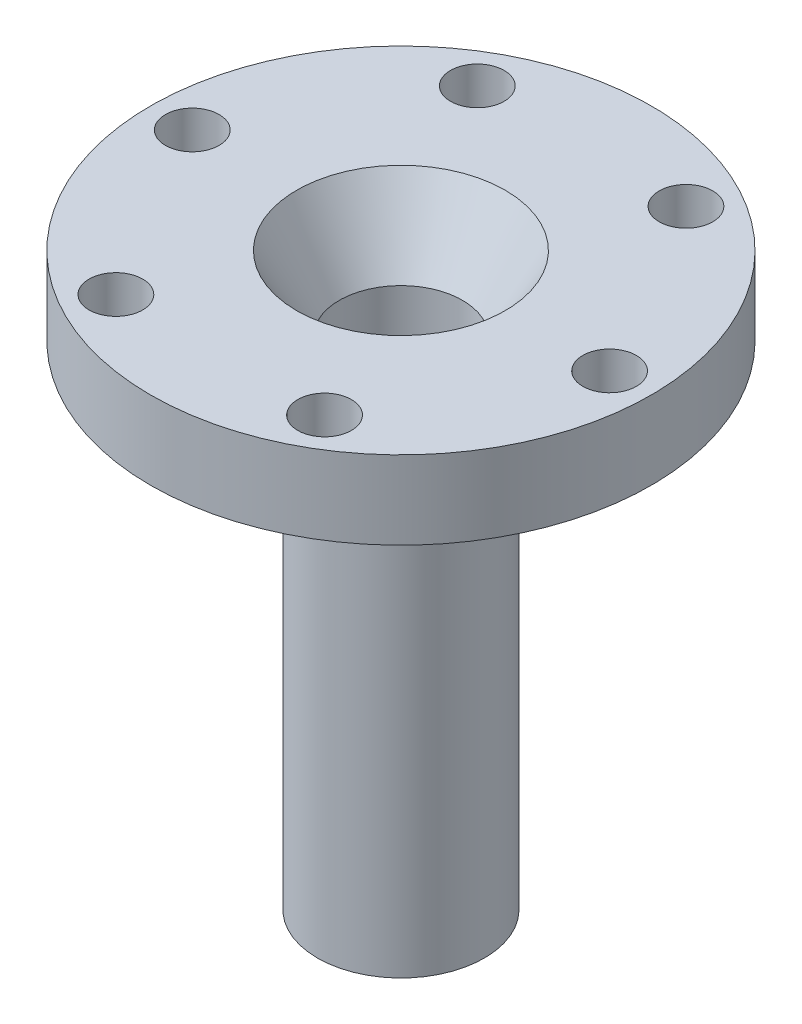
ISO-10303-21;
HEADER;
FILE_DESCRIPTION(('STEP AP214'),'2;1');
FILE_NAME('part.step','',(''),(''),'','','');
FILE_SCHEMA(('AUTOMOTIVE_DESIGN { 1 0 10303 214 1 1 1 1 }'));
ENDSEC;
DATA;
#1=APPLICATION_CONTEXT('core data for automotive mechanical design processes');
#2=APPLICATION_PROTOCOL_DEFINITION('international standard','automotive_design',2000,#1);
#3=PRODUCT_CONTEXT('',#1,'mechanical');
#4=PRODUCT('Part','Part','',(#3));
#5=PRODUCT_RELATED_PRODUCT_CATEGORY('part','',(#4));
#6=PRODUCT_DEFINITION_FORMATION('','',#4);
#7=PRODUCT_DEFINITION_CONTEXT('part definition',#1,'design');
#8=PRODUCT_DEFINITION('design','',#6,#7);
#9=PRODUCT_DEFINITION_SHAPE('','',#8);
#10=(LENGTH_UNIT() NAMED_UNIT(*) SI_UNIT(.MILLI.,.METRE.));
#11=(NAMED_UNIT(*) PLANE_ANGLE_UNIT() SI_UNIT($,.RADIAN.));
#12=(NAMED_UNIT(*) SI_UNIT($,.STERADIAN.) SOLID_ANGLE_UNIT());
#13=UNCERTAINTY_MEASURE_WITH_UNIT(LENGTH_MEASURE(1.E-05),#10,'distance_accuracy_value','');
#14=(GEOMETRIC_REPRESENTATION_CONTEXT(3) GLOBAL_UNCERTAINTY_ASSIGNED_CONTEXT((#13)) GLOBAL_UNIT_ASSIGNED_CONTEXT((#10,
#11,#12)) REPRESENTATION_CONTEXT('',''));
#15=CARTESIAN_POINT('',(0.,0.,0.));
#16=DIRECTION('',(0.,0.,1.));
#17=DIRECTION('',(1.,0.,0.));
#18=AXIS2_PLACEMENT_3D('',#15,#16,#17);
#19=CARTESIAN_POINT('',(10.16,-69.525,0.));
#20=DIRECTION('',(0.,1.,0.));
#21=DIRECTION('',(0.,0.,1.));
#22=AXIS2_PLACEMENT_3D('',#19,#20,#21);
#23=PLANE('',#22);
#24=CARTESIAN_POINT('',(0.,-69.525,0.));
#25=DIRECTION('',(0.,1.,0.));
#26=DIRECTION('',(0.,0.,1.));
#27=AXIS2_PLACEMENT_3D('',#24,#25,#26);
#28=CIRCLE('',#27,9.53200000000004);
#29=CARTESIAN_POINT('',(0.,-69.525,9.53200000000004));
#30=VERTEX_POINT('',#29);
#31=EDGE_CURVE('E53',#30,#30,#28,.T.);
#32=ORIENTED_EDGE('',*,*,#31,.T.);
#33=EDGE_LOOP('',(#32));
#34=FACE_BOUND('',#33,.T.);
#35=CARTESIAN_POINT('',(0.,-69.525,0.));
#36=DIRECTION('',(0.,1.,0.));
#37=DIRECTION('',(0.,0.,1.));
#38=AXIS2_PLACEMENT_3D('',#35,#36,#37);
#39=CIRCLE('',#38,10.16);
#40=CARTESIAN_POINT('',(0.,-69.525,10.16));
#41=VERTEX_POINT('',#40);
#42=EDGE_CURVE('E77',#41,#41,#39,.T.);
#43=ORIENTED_EDGE('',*,*,#42,.F.);
#44=EDGE_LOOP('',(#43));
#45=FACE_BOUND('',#44,.T.);
#46=ADVANCED_FACE('F33',(#34,#45),#23,.F.);
#47=CARTESIAN_POINT('',(0.,0.,0.));
#48=DIRECTION('',(0.,1.,0.));
#49=DIRECTION('',(0.,0.,1.));
#50=AXIS2_PLACEMENT_3D('',#47,#48,#49);
#51=CYLINDRICAL_SURFACE('',#50,7.50000000000001);
#52=CARTESIAN_POINT('',(0.,-68.1686275738593,0.));
#53=DIRECTION('',(0.,1.,0.));
#54=DIRECTION('',(0.,0.,1.));
#55=AXIS2_PLACEMENT_3D('',#52,#53,#54);
#56=CIRCLE('',#55,7.50000000000001);
#57=CARTESIAN_POINT('',(0.,-68.1686275738593,7.50000000000001));
#58=VERTEX_POINT('',#57);
#59=EDGE_CURVE('E48',#58,#58,#56,.F.);
#60=ORIENTED_EDGE('',*,*,#59,.T.);
#61=EDGE_LOOP('',(#60));
#62=FACE_BOUND('',#61,.T.);
#63=CARTESIAN_POINT('',(0.,-9.00666419935828,0.));
#64=DIRECTION('',(0.,1.,0.));
#65=DIRECTION('',(0.,0.,1.));
#66=AXIS2_PLACEMENT_3D('',#63,#64,#65);
#67=CIRCLE('',#66,7.50000000000001);
#68=CARTESIAN_POINT('',(0.,-9.00666419935828,7.50000000000001));
#69=VERTEX_POINT('',#68);
#70=EDGE_CURVE('E56',#69,#69,#67,.T.);
#71=ORIENTED_EDGE('',*,*,#70,.T.);
#72=EDGE_LOOP('',(#71));
#73=FACE_BOUND('',#72,.T.);
#74=ADVANCED_FACE('F147',(#62,#73),#51,.F.);
#75=CARTESIAN_POINT('',(0.,0.,0.));
#76=DIRECTION('',(0.,1.,0.));
#77=DIRECTION('',(0.,0.,1.));
#78=AXIS2_PLACEMENT_3D('',#75,#76,#77);
#79=CONICAL_SURFACE('',#78,12.7,0.523598775598293);
#80=ORIENTED_EDGE('',*,*,#70,.F.);
#81=EDGE_LOOP('',(#80));
#82=FACE_BOUND('',#81,.T.);
#83=CARTESIAN_POINT('',(0.,0.,0.));
#84=DIRECTION('',(0.,1.,0.));
#85=DIRECTION('',(0.,0.,1.));
#86=AXIS2_PLACEMENT_3D('',#83,#84,#85);
#87=CIRCLE('',#86,12.7);
#88=CARTESIAN_POINT('',(0.,0.,12.7));
#89=VERTEX_POINT('',#88);
#90=EDGE_CURVE('E68',#89,#89,#87,.T.);
#91=ORIENTED_EDGE('',*,*,#90,.T.);
#92=EDGE_LOOP('',(#91));
#93=FACE_BOUND('',#92,.T.);
#94=ADVANCED_FACE('F115',(#82,#93),#79,.F.);
#95=CARTESIAN_POINT('',(12.7,0.,0.));
#96=DIRECTION('',(0.,-1.,0.));
#97=DIRECTION('',(0.,0.,-1.));
#98=AXIS2_PLACEMENT_3D('',#95,#96,#97);
#99=PLANE('',#98);
#100=CARTESIAN_POINT('',(12.7000000000003,0.,-21.9970452561246));
#101=DIRECTION('',(0.,1.,0.));
#102=DIRECTION('',(0.,0.,1.));
#103=AXIS2_PLACEMENT_3D('',#100,#101,#102);
#104=CIRCLE('',#103,3.26389999999999);
#105=CARTESIAN_POINT('',(12.7000000000003,0.,-18.7331452561246));
#106=VERTEX_POINT('',#105);
#107=EDGE_CURVE('E104',#106,#106,#104,.T.);
#108=ORIENTED_EDGE('',*,*,#107,.F.);
#109=EDGE_LOOP('',(#108));
#110=FACE_BOUND('',#109,.T.);
#111=CARTESIAN_POINT('',(-12.6999999999998,0.,-21.9970452561249));
#112=DIRECTION('',(0.,1.,0.));
#113=DIRECTION('',(0.,0.,1.));
#114=AXIS2_PLACEMENT_3D('',#111,#112,#113);
#115=CIRCLE('',#114,3.26389999999999);
#116=CARTESIAN_POINT('',(-12.6999999999998,0.,-18.7331452561249));
#117=VERTEX_POINT('',#116);
#118=EDGE_CURVE('E61',#117,#117,#115,.T.);
#119=ORIENTED_EDGE('',*,*,#118,.F.);
#120=EDGE_LOOP('',(#119));
#121=FACE_BOUND('',#120,.T.);
#122=CARTESIAN_POINT('',(-25.4,0.,0.));
#123=DIRECTION('',(0.,1.,0.));
#124=DIRECTION('',(0.,0.,1.));
#125=AXIS2_PLACEMENT_3D('',#122,#123,#124);
#126=CIRCLE('',#125,3.26389999999999);
#127=CARTESIAN_POINT('',(-25.4,0.,3.26389999999999));
#128=VERTEX_POINT('',#127);
#129=EDGE_CURVE('E60',#128,#128,#126,.T.);
#130=ORIENTED_EDGE('',*,*,#129,.F.);
#131=EDGE_LOOP('',(#130));
#132=FACE_BOUND('',#131,.T.);
#133=CARTESIAN_POINT('',(-12.7000000000001,0.,21.9970452561247));
#134=DIRECTION('',(0.,1.,0.));
#135=DIRECTION('',(0.,0.,1.));
#136=AXIS2_PLACEMENT_3D('',#133,#134,#135);
#137=CIRCLE('',#136,3.26389999999999);
#138=CARTESIAN_POINT('',(-12.7000000000001,0.,25.2609452561247));
#139=VERTEX_POINT('',#138);
#140=EDGE_CURVE('E65',#139,#139,#137,.T.);
#141=ORIENTED_EDGE('',*,*,#140,.F.);
#142=EDGE_LOOP('',(#141));
#143=FACE_BOUND('',#142,.T.);
#144=CARTESIAN_POINT('',(12.6999999999999,0.,21.9970452561248));
#145=DIRECTION('',(0.,1.,0.));
#146=DIRECTION('',(0.,0.,1.));
#147=AXIS2_PLACEMENT_3D('',#144,#145,#146);
#148=CIRCLE('',#147,3.26389999999999);
#149=CARTESIAN_POINT('',(12.6999999999999,0.,25.2609452561248));
#150=VERTEX_POINT('',#149);
#151=EDGE_CURVE('E89',#150,#150,#148,.T.);
#152=ORIENTED_EDGE('',*,*,#151,.F.);
#153=EDGE_LOOP('',(#152));
#154=FACE_BOUND('',#153,.T.);
#155=CARTESIAN_POINT('',(25.4,0.,0.));
#156=DIRECTION('',(0.,1.,0.));
#157=DIRECTION('',(0.,0.,1.));
#158=AXIS2_PLACEMENT_3D('',#155,#156,#157);
#159=CIRCLE('',#158,3.26389999999999);
#160=CARTESIAN_POINT('',(25.4,0.,3.26389999999999));
#161=VERTEX_POINT('',#160);
#162=EDGE_CURVE('E83',#161,#161,#159,.T.);
#163=ORIENTED_EDGE('',*,*,#162,.F.);
#164=EDGE_LOOP('',(#163));
#165=FACE_BOUND('',#164,.T.);
#166=ORIENTED_EDGE('',*,*,#90,.F.);
#167=EDGE_LOOP('',(#166));
#168=FACE_BOUND('',#167,.T.);
#169=CARTESIAN_POINT('',(0.,0.,0.));
#170=DIRECTION('',(0.,1.,0.));
#171=DIRECTION('',(0.,0.,1.));
#172=AXIS2_PLACEMENT_3D('',#169,#170,#171);
#173=CIRCLE('',#172,30.48);
#174=CARTESIAN_POINT('',(0.,0.,30.48));
#175=VERTEX_POINT('',#174);
#176=EDGE_CURVE('E71',#175,#175,#173,.T.);
#177=ORIENTED_EDGE('',*,*,#176,.T.);
#178=EDGE_LOOP('',(#177));
#179=FACE_BOUND('',#178,.T.);
#180=ADVANCED_FACE('F111',(#110,#121,#132,#143,#154,#165,#168,#179),#99,.F.);
#181=CARTESIAN_POINT('',(0.,0.,0.));
#182=DIRECTION('',(0.,1.,0.));
#183=DIRECTION('',(0.,0.,1.));
#184=AXIS2_PLACEMENT_3D('',#181,#182,#183);
#185=CYLINDRICAL_SURFACE('',#184,30.48);
#186=ORIENTED_EDGE('',*,*,#176,.F.);
#187=EDGE_LOOP('',(#186));
#188=FACE_BOUND('',#187,.T.);
#189=CARTESIAN_POINT('',(0.,-9.525,0.));
#190=DIRECTION('',(0.,1.,0.));
#191=DIRECTION('',(0.,0.,1.));
#192=AXIS2_PLACEMENT_3D('',#189,#190,#191);
#193=CIRCLE('',#192,30.48);
#194=CARTESIAN_POINT('',(0.,-9.525,30.48));
#195=VERTEX_POINT('',#194);
#196=EDGE_CURVE('E74',#195,#195,#193,.T.);
#197=ORIENTED_EDGE('',*,*,#196,.T.);
#198=EDGE_LOOP('',(#197));
#199=FACE_BOUND('',#198,.T.);
#200=ADVANCED_FACE('F114',(#188,#199),#185,.T.);
#201=CARTESIAN_POINT('',(30.48,-9.525,0.));
#202=DIRECTION('',(0.,1.,0.));
#203=DIRECTION('',(0.,0.,1.));
#204=AXIS2_PLACEMENT_3D('',#201,#202,#203);
#205=PLANE('',#204);
#206=CARTESIAN_POINT('',(0.,-9.525,0.));
#207=DIRECTION('',(0.,1.,0.));
#208=DIRECTION('',(0.,0.,1.));
#209=AXIS2_PLACEMENT_3D('',#206,#207,#208);
#210=CIRCLE('',#209,13.335);
#211=CARTESIAN_POINT('',(0.,-9.525,13.335));
#212=VERTEX_POINT('',#211);
#213=EDGE_CURVE('E40',#212,#212,#210,.T.);
#214=ORIENTED_EDGE('',*,*,#213,.T.);
#215=EDGE_LOOP('',(#214));
#216=FACE_BOUND('',#215,.T.);
#217=CARTESIAN_POINT('',(12.7000000000003,-9.525,-21.9970452561246));
#218=DIRECTION('',(0.,1.,0.));
#219=DIRECTION('',(0.,0.,1.));
#220=AXIS2_PLACEMENT_3D('',#217,#218,#219);
#221=CIRCLE('',#220,3.26389999999999);
#222=CARTESIAN_POINT('',(12.7000000000003,-9.525,-18.7331452561246));
#223=VERTEX_POINT('',#222);
#224=EDGE_CURVE('E101',#223,#223,#221,.T.);
#225=ORIENTED_EDGE('',*,*,#224,.T.);
#226=EDGE_LOOP('',(#225));
#227=FACE_BOUND('',#226,.T.);
#228=CARTESIAN_POINT('',(-12.6999999999998,-9.525,-21.9970452561249));
#229=DIRECTION('',(0.,1.,0.));
#230=DIRECTION('',(0.,0.,1.));
#231=AXIS2_PLACEMENT_3D('',#228,#229,#230);
#232=CIRCLE('',#231,3.26389999999999);
#233=CARTESIAN_POINT('',(-12.6999999999998,-9.525,-18.7331452561249));
#234=VERTEX_POINT('',#233);
#235=EDGE_CURVE('E57',#234,#234,#232,.T.);
#236=ORIENTED_EDGE('',*,*,#235,.T.);
#237=EDGE_LOOP('',(#236));
#238=FACE_BOUND('',#237,.T.);
#239=CARTESIAN_POINT('',(-25.4,-9.525,0.));
#240=DIRECTION('',(0.,1.,0.));
#241=DIRECTION('',(0.,0.,1.));
#242=AXIS2_PLACEMENT_3D('',#239,#240,#241);
#243=CIRCLE('',#242,3.26389999999998);
#244=CARTESIAN_POINT('',(-25.4,-9.525,3.26389999999998));
#245=VERTEX_POINT('',#244);
#246=EDGE_CURVE('E62',#245,#245,#243,.T.);
#247=ORIENTED_EDGE('',*,*,#246,.T.);
#248=EDGE_LOOP('',(#247));
#249=FACE_BOUND('',#248,.T.);
#250=CARTESIAN_POINT('',(-12.7000000000001,-9.525,21.9970452561247));
#251=DIRECTION('',(0.,1.,0.));
#252=DIRECTION('',(0.,0.,1.));
#253=AXIS2_PLACEMENT_3D('',#250,#251,#252);
#254=CIRCLE('',#253,3.26389999999999);
#255=CARTESIAN_POINT('',(-12.7000000000001,-9.525,25.2609452561247));
#256=VERTEX_POINT('',#255);
#257=EDGE_CURVE('E92',#256,#256,#254,.T.);
#258=ORIENTED_EDGE('',*,*,#257,.T.);
#259=EDGE_LOOP('',(#258));
#260=FACE_BOUND('',#259,.T.);
#261=CARTESIAN_POINT('',(12.6999999999999,-9.525,21.9970452561248));
#262=DIRECTION('',(0.,1.,0.));
#263=DIRECTION('',(0.,0.,1.));
#264=AXIS2_PLACEMENT_3D('',#261,#262,#263);
#265=CIRCLE('',#264,3.26389999999999);
#266=CARTESIAN_POINT('',(12.6999999999999,-9.525,25.2609452561248));
#267=VERTEX_POINT('',#266);
#268=EDGE_CURVE('E86',#267,#267,#265,.T.);
#269=ORIENTED_EDGE('',*,*,#268,.T.);
#270=EDGE_LOOP('',(#269));
#271=FACE_BOUND('',#270,.T.);
#272=CARTESIAN_POINT('',(25.4,-9.525,0.));
#273=DIRECTION('',(0.,1.,0.));
#274=DIRECTION('',(0.,0.,1.));
#275=AXIS2_PLACEMENT_3D('',#272,#273,#274);
#276=CIRCLE('',#275,3.26389999999998);
#277=CARTESIAN_POINT('',(25.4,-9.525,3.26389999999998));
#278=VERTEX_POINT('',#277);
#279=EDGE_CURVE('E80',#278,#278,#276,.T.);
#280=ORIENTED_EDGE('',*,*,#279,.T.);
#281=EDGE_LOOP('',(#280));
#282=FACE_BOUND('',#281,.T.);
#283=ORIENTED_EDGE('',*,*,#196,.F.);
#284=EDGE_LOOP('',(#283));
#285=FACE_BOUND('',#284,.T.);
#286=ADVANCED_FACE('F133',(#216,#227,#238,#249,#260,#271,#282,#285),#205,.F.);
#287=CARTESIAN_POINT('',(0.,0.,0.));
#288=DIRECTION('',(0.,1.,0.));
#289=DIRECTION('',(0.,0.,1.));
#290=AXIS2_PLACEMENT_3D('',#287,#288,#289);
#291=CYLINDRICAL_SURFACE('',#290,10.16);
#292=CARTESIAN_POINT('',(0.,-12.7,0.));
#293=DIRECTION('',(0.,1.,0.));
#294=DIRECTION('',(0.,0.,1.));
#295=AXIS2_PLACEMENT_3D('',#292,#293,#294);
#296=CIRCLE('',#295,10.16);
#297=CARTESIAN_POINT('',(0.,-12.7,10.16));
#298=VERTEX_POINT('',#297);
#299=EDGE_CURVE('E10',#298,#298,#296,.F.);
#300=ORIENTED_EDGE('',*,*,#299,.T.);
#301=EDGE_LOOP('',(#300));
#302=FACE_BOUND('',#301,.T.);
#303=ORIENTED_EDGE('',*,*,#42,.T.);
#304=EDGE_LOOP('',(#303));
#305=FACE_BOUND('',#304,.T.);
#306=ADVANCED_FACE('F138',(#302,#305),#291,.T.);
#307=CARTESIAN_POINT('',(25.4,0.,0.));
#308=DIRECTION('',(0.,1.,0.));
#309=DIRECTION('',(0.,0.,1.));
#310=AXIS2_PLACEMENT_3D('',#307,#308,#309);
#311=CYLINDRICAL_SURFACE('',#310,3.26389999999998);
#312=ORIENTED_EDGE('',*,*,#162,.T.);
#313=EDGE_LOOP('',(#312));
#314=FACE_BOUND('',#313,.T.);
#315=ORIENTED_EDGE('',*,*,#279,.F.);
#316=EDGE_LOOP('',(#315));
#317=FACE_BOUND('',#316,.T.);
#318=ADVANCED_FACE('F143',(#314,#317),#311,.F.);
#319=CARTESIAN_POINT('',(12.6999999999999,0.,21.9970452561248));
#320=DIRECTION('',(0.,1.,0.));
#321=DIRECTION('',(0.,0.,1.));
#322=AXIS2_PLACEMENT_3D('',#319,#320,#321);
#323=CYLINDRICAL_SURFACE('',#322,3.26389999999999);
#324=ORIENTED_EDGE('',*,*,#151,.T.);
#325=EDGE_LOOP('',(#324));
#326=FACE_BOUND('',#325,.T.);
#327=ORIENTED_EDGE('',*,*,#268,.F.);
#328=EDGE_LOOP('',(#327));
#329=FACE_BOUND('',#328,.T.);
#330=ADVANCED_FACE('F198',(#326,#329),#323,.F.);
#331=CARTESIAN_POINT('',(-12.7000000000001,0.,21.9970452561247));
#332=DIRECTION('',(0.,1.,0.));
#333=DIRECTION('',(0.,0.,1.));
#334=AXIS2_PLACEMENT_3D('',#331,#332,#333);
#335=CYLINDRICAL_SURFACE('',#334,3.26389999999999);
#336=ORIENTED_EDGE('',*,*,#140,.T.);
#337=EDGE_LOOP('',(#336));
#338=FACE_BOUND('',#337,.T.);
#339=ORIENTED_EDGE('',*,*,#257,.F.);
#340=EDGE_LOOP('',(#339));
#341=FACE_BOUND('',#340,.T.);
#342=ADVANCED_FACE('F211',(#338,#341),#335,.F.);
#343=CARTESIAN_POINT('',(-25.4,0.,0.));
#344=DIRECTION('',(0.,1.,0.));
#345=DIRECTION('',(0.,0.,1.));
#346=AXIS2_PLACEMENT_3D('',#343,#344,#345);
#347=CYLINDRICAL_SURFACE('',#346,3.26389999999998);
#348=ORIENTED_EDGE('',*,*,#129,.T.);
#349=EDGE_LOOP('',(#348));
#350=FACE_BOUND('',#349,.T.);
#351=ORIENTED_EDGE('',*,*,#246,.F.);
#352=EDGE_LOOP('',(#351));
#353=FACE_BOUND('',#352,.T.);
#354=ADVANCED_FACE('F218',(#350,#353),#347,.F.);
#355=CARTESIAN_POINT('',(-12.6999999999998,0.,-21.9970452561249));
#356=DIRECTION('',(0.,1.,0.));
#357=DIRECTION('',(0.,0.,1.));
#358=AXIS2_PLACEMENT_3D('',#355,#356,#357);
#359=CYLINDRICAL_SURFACE('',#358,3.26389999999999);
#360=ORIENTED_EDGE('',*,*,#118,.T.);
#361=EDGE_LOOP('',(#360));
#362=FACE_BOUND('',#361,.T.);
#363=ORIENTED_EDGE('',*,*,#235,.F.);
#364=EDGE_LOOP('',(#363));
#365=FACE_BOUND('',#364,.T.);
#366=ADVANCED_FACE('F226',(#362,#365),#359,.F.);
#367=CARTESIAN_POINT('',(12.7000000000003,0.,-21.9970452561246));
#368=DIRECTION('',(0.,1.,0.));
#369=DIRECTION('',(0.,0.,1.));
#370=AXIS2_PLACEMENT_3D('',#367,#368,#369);
#371=CYLINDRICAL_SURFACE('',#370,3.26389999999999);
#372=ORIENTED_EDGE('',*,*,#107,.T.);
#373=EDGE_LOOP('',(#372));
#374=FACE_BOUND('',#373,.T.);
#375=ORIENTED_EDGE('',*,*,#224,.F.);
#376=EDGE_LOOP('',(#375));
#377=FACE_BOUND('',#376,.T.);
#378=ADVANCED_FACE('F108',(#374,#377),#371,.F.);
#379=CARTESIAN_POINT('',(0.,-69.525,0.));
#380=DIRECTION('',(0.,-1.,0.));
#381=DIRECTION('',(0.,0.,-1.));
#382=AXIS2_PLACEMENT_3D('',#379,#380,#381);
#383=CONICAL_SURFACE('',#382,9.53200000000004,1.18682389135615);
#384=CARTESIAN_POINT('',(0.,-68.9045797584217,0.));
#385=DIRECTION('',(0.,-1.,0.));
#386=DIRECTION('',(0.,0.,-1.));
#387=AXIS2_PLACEMENT_3D('',#384,#385,#386);
#388=CIRCLE('',#387,7.99640601647613);
#389=CARTESIAN_POINT('',(0.,-68.9045797584217,-7.99640601647613));
#390=VERTEX_POINT('',#389);
#391=EDGE_CURVE('E44',#390,#390,#388,.F.);
#392=ORIENTED_EDGE('',*,*,#391,.T.);
#393=EDGE_LOOP('',(#392));
#394=FACE_BOUND('',#393,.T.);
#395=ORIENTED_EDGE('',*,*,#31,.F.);
#396=EDGE_LOOP('',(#395));
#397=FACE_BOUND('',#396,.T.);
#398=ADVANCED_FACE('F158',(#394,#397),#383,.F.);
#399=CARTESIAN_POINT('',(0.,-68.1686275738593,0.));
#400=DIRECTION('',(0.,1.,0.));
#401=DIRECTION('',(0.,0.,1.));
#402=AXIS2_PLACEMENT_3D('',#399,#400,#401);
#403=TOROIDAL_SURFACE('',#402,8.29375000000001,0.79375);
#404=ORIENTED_EDGE('',*,*,#391,.F.);
#405=EDGE_LOOP('',(#404));
#406=FACE_BOUND('',#405,.T.);
#407=ORIENTED_EDGE('',*,*,#59,.F.);
#408=EDGE_LOOP('',(#407));
#409=FACE_BOUND('',#408,.T.);
#410=ADVANCED_FACE('F160',(#406,#409),#403,.T.);
#411=CARTESIAN_POINT('',(0.,-9.525,0.));
#412=DIRECTION('',(0.,1.,0.));
#413=DIRECTION('',(0.,0.,1.));
#414=AXIS2_PLACEMENT_3D('',#411,#412,#413);
#415=CONICAL_SURFACE('',#414,13.335,0.785398163397452);
#416=ORIENTED_EDGE('',*,*,#299,.F.);
#417=EDGE_LOOP('',(#416));
#418=FACE_BOUND('',#417,.T.);
#419=ORIENTED_EDGE('',*,*,#213,.F.);
#420=EDGE_LOOP('',(#419));
#421=FACE_BOUND('',#420,.T.);
#422=ADVANCED_FACE('F35',(#418,#421),#415,.T.);
#423=CLOSED_SHELL('',(#46,#74,#94,#180,#200,#286,#306,#318,#330,#342,#354,#366,#378,#398,#410,#422));
#424=MANIFOLD_SOLID_BREP('B2',#423);
#425=ADVANCED_BREP_SHAPE_REPRESENTATION('',(#18,#424),#14);
#426=SHAPE_DEFINITION_REPRESENTATION(#9,#425);
ENDSEC;
END-ISO-10303-21;
